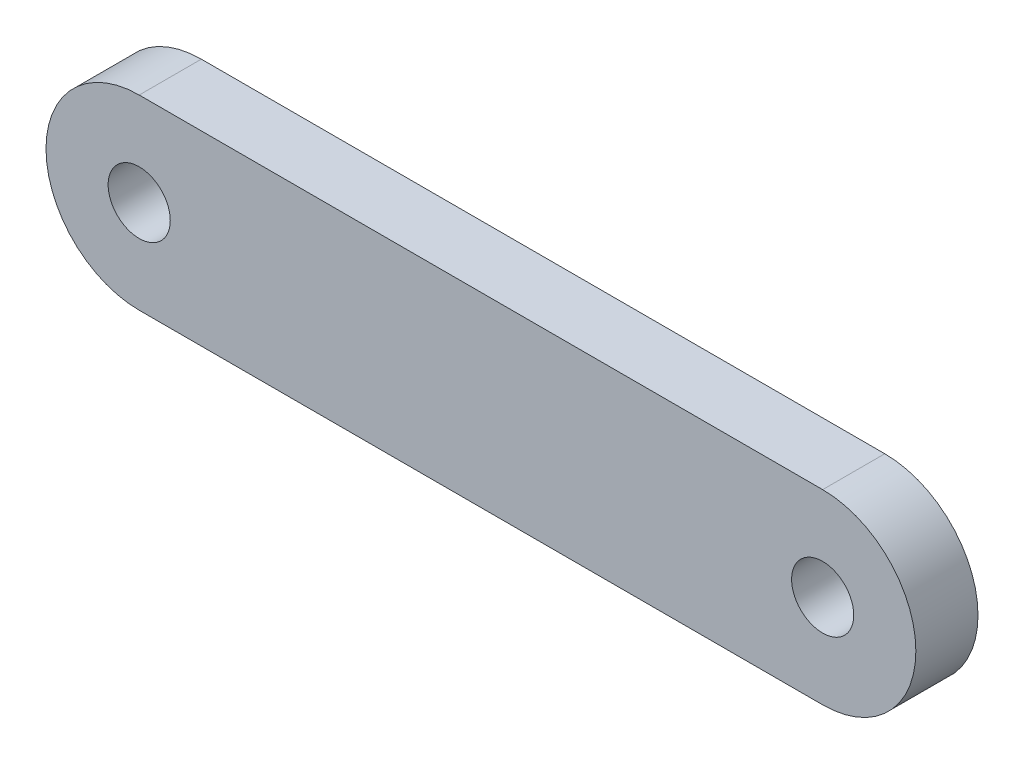
ISO-10303-21;
HEADER;
FILE_DESCRIPTION(('STEP AP214'),'2;1');
FILE_NAME('part.step','',(''),(''),'','','');
FILE_SCHEMA(('AUTOMOTIVE_DESIGN { 1 0 10303 214 1 1 1 1 }'));
ENDSEC;
DATA;
#1=APPLICATION_CONTEXT('core data for automotive mechanical design processes');
#2=APPLICATION_PROTOCOL_DEFINITION('international standard','automotive_design',2000,#1);
#3=PRODUCT_CONTEXT('',#1,'mechanical');
#4=PRODUCT('Part','Part','',(#3));
#5=PRODUCT_RELATED_PRODUCT_CATEGORY('part','',(#4));
#6=PRODUCT_DEFINITION_FORMATION('','',#4);
#7=PRODUCT_DEFINITION_CONTEXT('part definition',#1,'design');
#8=PRODUCT_DEFINITION('design','',#6,#7);
#9=PRODUCT_DEFINITION_SHAPE('','',#8);
#10=(LENGTH_UNIT() NAMED_UNIT(*) SI_UNIT(.MILLI.,.METRE.));
#11=(NAMED_UNIT(*) PLANE_ANGLE_UNIT() SI_UNIT($,.RADIAN.));
#12=(NAMED_UNIT(*) SI_UNIT($,.STERADIAN.) SOLID_ANGLE_UNIT());
#13=UNCERTAINTY_MEASURE_WITH_UNIT(LENGTH_MEASURE(1.E-05),#10,'distance_accuracy_value','');
#14=(GEOMETRIC_REPRESENTATION_CONTEXT(3) GLOBAL_UNCERTAINTY_ASSIGNED_CONTEXT((#13)) GLOBAL_UNIT_ASSIGNED_CONTEXT((#10,
#11,#12)) REPRESENTATION_CONTEXT('',''));
#15=CARTESIAN_POINT('',(0.,0.,0.));
#16=DIRECTION('',(0.,0.,1.));
#17=DIRECTION('',(1.,0.,0.));
#18=AXIS2_PLACEMENT_3D('',#15,#16,#17);
#19=CARTESIAN_POINT('',(-55.,0.,10.));
#20=DIRECTION('',(0.,0.,1.));
#21=DIRECTION('',(1.,0.,0.));
#22=AXIS2_PLACEMENT_3D('',#19,#20,#21);
#23=PLANE('',#22);
#24=CARTESIAN_POINT('',(-55.,0.,10.));
#25=DIRECTION('',(0.,0.,1.));
#26=DIRECTION('',(1.,0.,0.));
#27=AXIS2_PLACEMENT_3D('',#24,#25,#26);
#28=CIRCLE('',#27,5.);
#29=CARTESIAN_POINT('',(-50.,0.,10.));
#30=VERTEX_POINT('',#29);
#31=EDGE_CURVE('E112',#30,#30,#28,.T.);
#32=ORIENTED_EDGE('',*,*,#31,.F.);
#33=EDGE_LOOP('',(#32));
#34=FACE_BOUND('',#33,.T.);
#35=CARTESIAN_POINT('',(-55.,0.,10.));
#36=DIRECTION('',(0.,0.,1.));
#37=DIRECTION('',(1.,0.,0.));
#38=AXIS2_PLACEMENT_3D('',#35,#36,#37);
#39=CIRCLE('',#38,15.);
#40=CARTESIAN_POINT('',(-55.,15.,10.));
#41=VERTEX_POINT('',#40);
#42=CARTESIAN_POINT('',(-55.,-15.,10.));
#43=VERTEX_POINT('',#42);
#44=EDGE_CURVE('E92',#41,#43,#39,.T.);
#45=ORIENTED_EDGE('',*,*,#44,.T.);
#46=DIRECTION('',(1.,0.,0.));
#47=VECTOR('',#46,1.);
#48=CARTESIAN_POINT('',(-55.,-15.,10.));
#49=LINE('',#48,#47);
#50=CARTESIAN_POINT('',(55.,-15.,10.));
#51=VERTEX_POINT('',#50);
#52=EDGE_CURVE('E87',#43,#51,#49,.T.);
#53=ORIENTED_EDGE('',*,*,#52,.T.);
#54=CARTESIAN_POINT('',(55.,0.,10.));
#55=DIRECTION('',(0.,0.,1.));
#56=DIRECTION('',(1.,0.,0.));
#57=AXIS2_PLACEMENT_3D('',#54,#55,#56);
#58=CIRCLE('',#57,15.);
#59=CARTESIAN_POINT('',(55.,15.,10.));
#60=VERTEX_POINT('',#59);
#61=EDGE_CURVE('E90',#51,#60,#58,.T.);
#62=ORIENTED_EDGE('',*,*,#61,.T.);
#63=DIRECTION('',(-1.,0.,0.));
#64=VECTOR('',#63,1.);
#65=CARTESIAN_POINT('',(-55.,15.,10.));
#66=LINE('',#65,#64);
#67=EDGE_CURVE('E57',#60,#41,#66,.T.);
#68=ORIENTED_EDGE('',*,*,#67,.T.);
#69=EDGE_LOOP('',(#45,#53,#62,#68));
#70=FACE_BOUND('',#69,.T.);
#71=CARTESIAN_POINT('',(55.,0.,10.));
#72=DIRECTION('',(0.,0.,1.));
#73=DIRECTION('',(1.,0.,0.));
#74=AXIS2_PLACEMENT_3D('',#71,#72,#73);
#75=CIRCLE('',#74,5.);
#76=CARTESIAN_POINT('',(60.,0.,10.));
#77=VERTEX_POINT('',#76);
#78=EDGE_CURVE('E134',#77,#77,#75,.T.);
#79=ORIENTED_EDGE('',*,*,#78,.F.);
#80=EDGE_LOOP('',(#79));
#81=FACE_BOUND('',#80,.T.);
#82=ADVANCED_FACE('F39',(#34,#70,#81),#23,.T.);
#83=CARTESIAN_POINT('',(-55.,0.,0.));
#84=DIRECTION('',(0.,0.,1.));
#85=DIRECTION('',(1.,0.,0.));
#86=AXIS2_PLACEMENT_3D('',#83,#84,#85);
#87=PLANE('',#86);
#88=CARTESIAN_POINT('',(-55.,0.,0.));
#89=DIRECTION('',(0.,0.,1.));
#90=DIRECTION('',(1.,0.,0.));
#91=AXIS2_PLACEMENT_3D('',#88,#89,#90);
#92=CIRCLE('',#91,15.);
#93=CARTESIAN_POINT('',(-55.,15.,0.));
#94=VERTEX_POINT('',#93);
#95=CARTESIAN_POINT('',(-55.,-15.,0.));
#96=VERTEX_POINT('',#95);
#97=EDGE_CURVE('E108',#94,#96,#92,.T.);
#98=ORIENTED_EDGE('',*,*,#97,.F.);
#99=DIRECTION('',(-1.,0.,0.));
#100=VECTOR('',#99,1.);
#101=CARTESIAN_POINT('',(-55.,15.,0.));
#102=LINE('',#101,#100);
#103=CARTESIAN_POINT('',(55.,15.,0.));
#104=VERTEX_POINT('',#103);
#105=EDGE_CURVE('E80',#104,#94,#102,.T.);
#106=ORIENTED_EDGE('',*,*,#105,.F.);
#107=CARTESIAN_POINT('',(55.,0.,0.));
#108=DIRECTION('',(0.,0.,1.));
#109=DIRECTION('',(1.,0.,0.));
#110=AXIS2_PLACEMENT_3D('',#107,#108,#109);
#111=CIRCLE('',#110,15.);
#112=CARTESIAN_POINT('',(55.,-15.,0.));
#113=VERTEX_POINT('',#112);
#114=EDGE_CURVE('E74',#113,#104,#111,.T.);
#115=ORIENTED_EDGE('',*,*,#114,.F.);
#116=DIRECTION('',(1.,0.,0.));
#117=VECTOR('',#116,1.);
#118=CARTESIAN_POINT('',(-55.,-15.,0.));
#119=LINE('',#118,#117);
#120=EDGE_CURVE('E97',#96,#113,#119,.T.);
#121=ORIENTED_EDGE('',*,*,#120,.F.);
#122=EDGE_LOOP('',(#98,#106,#115,#121));
#123=FACE_BOUND('',#122,.T.);
#124=CARTESIAN_POINT('',(-55.,0.,0.));
#125=DIRECTION('',(0.,0.,1.));
#126=DIRECTION('',(1.,0.,0.));
#127=AXIS2_PLACEMENT_3D('',#124,#125,#126);
#128=CIRCLE('',#127,5.);
#129=CARTESIAN_POINT('',(-50.,0.,0.));
#130=VERTEX_POINT('',#129);
#131=EDGE_CURVE('E130',#130,#130,#128,.T.);
#132=ORIENTED_EDGE('',*,*,#131,.T.);
#133=EDGE_LOOP('',(#132));
#134=FACE_BOUND('',#133,.T.);
#135=CARTESIAN_POINT('',(55.,0.,0.));
#136=DIRECTION('',(0.,0.,1.));
#137=DIRECTION('',(1.,0.,0.));
#138=AXIS2_PLACEMENT_3D('',#135,#136,#137);
#139=CIRCLE('',#138,5.);
#140=CARTESIAN_POINT('',(60.,0.,0.));
#141=VERTEX_POINT('',#140);
#142=EDGE_CURVE('E138',#141,#141,#139,.T.);
#143=ORIENTED_EDGE('',*,*,#142,.T.);
#144=EDGE_LOOP('',(#143));
#145=FACE_BOUND('',#144,.T.);
#146=ADVANCED_FACE('F125',(#123,#134,#145),#87,.F.);
#147=CARTESIAN_POINT('',(-55.,0.,10.));
#148=DIRECTION('',(0.,0.,-1.));
#149=DIRECTION('',(-1.,0.,0.));
#150=AXIS2_PLACEMENT_3D('',#147,#148,#149);
#151=CYLINDRICAL_SURFACE('',#150,15.);
#152=ORIENTED_EDGE('',*,*,#97,.T.);
#153=DIRECTION('',(0.,0.,-1.));
#154=VECTOR('',#153,1.);
#155=CARTESIAN_POINT('',(-55.,-15.,10.));
#156=LINE('',#155,#154);
#157=EDGE_CURVE('E11',#43,#96,#156,.T.);
#158=ORIENTED_EDGE('',*,*,#157,.F.);
#159=ORIENTED_EDGE('',*,*,#44,.F.);
#160=DIRECTION('',(0.,0.,-1.));
#161=VECTOR('',#160,1.);
#162=CARTESIAN_POINT('',(-55.,15.,10.));
#163=LINE('',#162,#161);
#164=EDGE_CURVE('E104',#41,#94,#163,.T.);
#165=ORIENTED_EDGE('',*,*,#164,.T.);
#166=EDGE_LOOP('',(#152,#158,#159,#165));
#167=FACE_BOUND('',#166,.T.);
#168=ADVANCED_FACE('F41',(#167),#151,.T.);
#169=CARTESIAN_POINT('',(-55.,-15.,10.));
#170=DIRECTION('',(0.,1.,0.));
#171=DIRECTION('',(0.,0.,1.));
#172=AXIS2_PLACEMENT_3D('',#169,#170,#171);
#173=PLANE('',#172);
#174=ORIENTED_EDGE('',*,*,#120,.T.);
#175=DIRECTION('',(0.,0.,-1.));
#176=VECTOR('',#175,1.);
#177=CARTESIAN_POINT('',(55.,-15.,10.));
#178=LINE('',#177,#176);
#179=EDGE_CURVE('E49',#51,#113,#178,.T.);
#180=ORIENTED_EDGE('',*,*,#179,.F.);
#181=ORIENTED_EDGE('',*,*,#52,.F.);
#182=ORIENTED_EDGE('',*,*,#157,.T.);
#183=EDGE_LOOP('',(#174,#180,#181,#182));
#184=FACE_BOUND('',#183,.T.);
#185=ADVANCED_FACE('F96',(#184),#173,.F.);
#186=CARTESIAN_POINT('',(55.,0.,10.));
#187=DIRECTION('',(0.,0.,-1.));
#188=DIRECTION('',(-1.,0.,0.));
#189=AXIS2_PLACEMENT_3D('',#186,#187,#188);
#190=CYLINDRICAL_SURFACE('',#189,15.);
#191=ORIENTED_EDGE('',*,*,#114,.T.);
#192=DIRECTION('',(0.,0.,-1.));
#193=VECTOR('',#192,1.);
#194=CARTESIAN_POINT('',(55.,15.,10.));
#195=LINE('',#194,#193);
#196=EDGE_CURVE('E99',#60,#104,#195,.T.);
#197=ORIENTED_EDGE('',*,*,#196,.F.);
#198=ORIENTED_EDGE('',*,*,#61,.F.);
#199=ORIENTED_EDGE('',*,*,#179,.T.);
#200=EDGE_LOOP('',(#191,#197,#198,#199));
#201=FACE_BOUND('',#200,.T.);
#202=ADVANCED_FACE('F100',(#201),#190,.T.);
#203=CARTESIAN_POINT('',(-55.,15.,10.));
#204=DIRECTION('',(0.,-1.,0.));
#205=DIRECTION('',(0.,0.,-1.));
#206=AXIS2_PLACEMENT_3D('',#203,#204,#205);
#207=PLANE('',#206);
#208=ORIENTED_EDGE('',*,*,#105,.T.);
#209=ORIENTED_EDGE('',*,*,#164,.F.);
#210=ORIENTED_EDGE('',*,*,#67,.F.);
#211=ORIENTED_EDGE('',*,*,#196,.T.);
#212=EDGE_LOOP('',(#208,#209,#210,#211));
#213=FACE_BOUND('',#212,.T.);
#214=ADVANCED_FACE('F122',(#213),#207,.F.);
#215=CARTESIAN_POINT('',(-55.,0.,10.));
#216=DIRECTION('',(0.,0.,-1.));
#217=DIRECTION('',(-1.,0.,0.));
#218=AXIS2_PLACEMENT_3D('',#215,#216,#217);
#219=CYLINDRICAL_SURFACE('',#218,5.);
#220=ORIENTED_EDGE('',*,*,#31,.T.);
#221=EDGE_LOOP('',(#220));
#222=FACE_BOUND('',#221,.T.);
#223=ORIENTED_EDGE('',*,*,#131,.F.);
#224=EDGE_LOOP('',(#223));
#225=FACE_BOUND('',#224,.T.);
#226=ADVANCED_FACE('F157',(#222,#225),#219,.F.);
#227=CARTESIAN_POINT('',(55.,0.,10.));
#228=DIRECTION('',(0.,0.,-1.));
#229=DIRECTION('',(-1.,0.,0.));
#230=AXIS2_PLACEMENT_3D('',#227,#228,#229);
#231=CYLINDRICAL_SURFACE('',#230,5.);
#232=ORIENTED_EDGE('',*,*,#78,.T.);
#233=EDGE_LOOP('',(#232));
#234=FACE_BOUND('',#233,.T.);
#235=ORIENTED_EDGE('',*,*,#142,.F.);
#236=EDGE_LOOP('',(#235));
#237=FACE_BOUND('',#236,.T.);
#238=ADVANCED_FACE('F146',(#234,#237),#231,.F.);
#239=CLOSED_SHELL('',(#82,#146,#168,#185,#202,#214,#226,#238));
#240=MANIFOLD_SOLID_BREP('B2',#239);
#241=ADVANCED_BREP_SHAPE_REPRESENTATION('',(#18,#240),#14);
#242=SHAPE_DEFINITION_REPRESENTATION(#9,#241);
ENDSEC;
END-ISO-10303-21;
